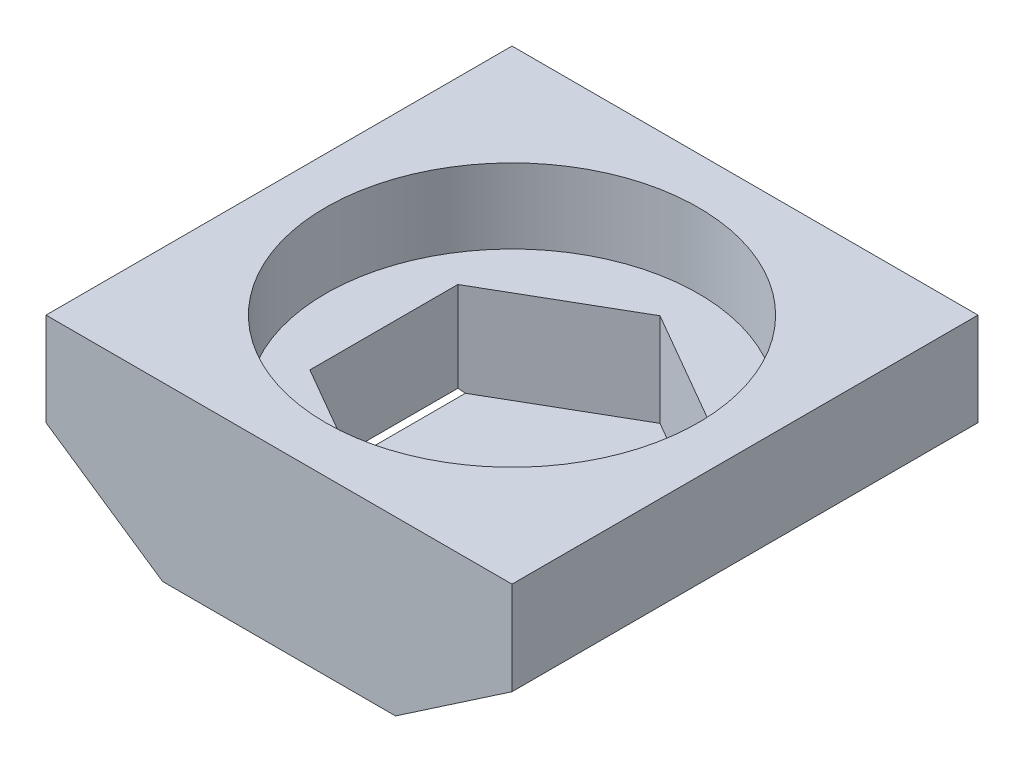
ISO-10303-21;
HEADER;
FILE_DESCRIPTION(('STEP AP214'),'2;1');
FILE_NAME('part.step','',(''),(''),'','','');
FILE_SCHEMA(('AUTOMOTIVE_DESIGN { 1 0 10303 214 1 1 1 1 }'));
ENDSEC;
DATA;
#1=APPLICATION_CONTEXT('core data for automotive mechanical design processes');
#2=APPLICATION_PROTOCOL_DEFINITION('international standard','automotive_design',2000,#1);
#3=PRODUCT_CONTEXT('',#1,'mechanical');
#4=PRODUCT('Part','Part','',(#3));
#5=PRODUCT_RELATED_PRODUCT_CATEGORY('part','',(#4));
#6=PRODUCT_DEFINITION_FORMATION('','',#4);
#7=PRODUCT_DEFINITION_CONTEXT('part definition',#1,'design');
#8=PRODUCT_DEFINITION('design','',#6,#7);
#9=PRODUCT_DEFINITION_SHAPE('','',#8);
#10=(LENGTH_UNIT() NAMED_UNIT(*) SI_UNIT(.MILLI.,.METRE.));
#11=(NAMED_UNIT(*) PLANE_ANGLE_UNIT() SI_UNIT($,.RADIAN.));
#12=(NAMED_UNIT(*) SI_UNIT($,.STERADIAN.) SOLID_ANGLE_UNIT());
#13=UNCERTAINTY_MEASURE_WITH_UNIT(LENGTH_MEASURE(1.E-05),#10,'distance_accuracy_value','');
#14=(GEOMETRIC_REPRESENTATION_CONTEXT(3) GLOBAL_UNCERTAINTY_ASSIGNED_CONTEXT((#13)) GLOBAL_UNIT_ASSIGNED_CONTEXT((#10,
#11,#12)) REPRESENTATION_CONTEXT('',''));
#15=CARTESIAN_POINT('',(0.,0.,0.));
#16=DIRECTION('',(0.,0.,1.));
#17=DIRECTION('',(1.,0.,0.));
#18=AXIS2_PLACEMENT_3D('',#15,#16,#17);
#19=CARTESIAN_POINT('',(0.,0.0999999999999994,8.17542648054294));
#20=DIRECTION('',(0.5,0.,0.866025403784438));
#21=DIRECTION('',(0.866025403784439,0.,-0.5));
#22=AXIS2_PLACEMENT_3D('',#19,#20,#21);
#23=PLANE('',#22);
#24=DIRECTION('',(-0.866025403784439,0.,0.5));
#25=VECTOR('',#24,1.);
#26=CARTESIAN_POINT('',(0.,2.1,8.17542648054294));
#27=LINE('',#26,#25);
#28=CARTESIAN_POINT('',(2.75,2.1,6.58771324027147));
#29=VERTEX_POINT('',#28);
#30=CARTESIAN_POINT('',(0.,2.1,8.17542648054294));
#31=VERTEX_POINT('',#30);
#32=EDGE_CURVE('E151',#29,#31,#27,.T.);
#33=ORIENTED_EDGE('',*,*,#32,.F.);
#34=DIRECTION('',(0.,1.,0.));
#35=VECTOR('',#34,1.);
#36=CARTESIAN_POINT('',(2.75,0.0999999999999994,6.58771324027147));
#37=LINE('',#36,#35);
#38=CARTESIAN_POINT('',(2.75,0.169999999999999,6.58771324027147));
#39=VERTEX_POINT('',#38);
#40=EDGE_CURVE('E161',#39,#29,#37,.T.);
#41=ORIENTED_EDGE('',*,*,#40,.F.);
#42=DIRECTION('',(0.746240950950534,0.507443846646363,-0.430842413911613));
#43=VECTOR('',#42,1.);
#44=CARTESIAN_POINT('',(1.44931429353943,-0.71446628039319,7.33866448302758));
#45=LINE('',#44,#43);
#46=CARTESIAN_POINT('',(2.64705882352941,0.0999999999999994,6.64714635621746));
#47=VERTEX_POINT('',#46);
#48=EDGE_CURVE('E177',#47,#39,#45,.T.);
#49=ORIENTED_EDGE('',*,*,#48,.F.);
#50=DIRECTION('',(0.866025403784439,0.,-0.5));
#51=VECTOR('',#50,1.);
#52=CARTESIAN_POINT('',(0.,0.0999999999999994,8.17542648054294));
#53=LINE('',#52,#51);
#54=CARTESIAN_POINT('',(0.,0.0999999999999994,8.17542648054294));
#55=VERTEX_POINT('',#54);
#56=EDGE_CURVE('E59',#55,#47,#53,.T.);
#57=ORIENTED_EDGE('',*,*,#56,.F.);
#58=DIRECTION('',(0.,1.,0.));
#59=VECTOR('',#58,1.);
#60=CARTESIAN_POINT('',(0.,0.0999999999999994,8.17542648054294));
#61=LINE('',#60,#59);
#62=EDGE_CURVE('E171',#55,#31,#61,.T.);
#63=ORIENTED_EDGE('',*,*,#62,.T.);
#64=EDGE_LOOP('',(#33,#41,#49,#57,#63));
#65=FACE_BOUND('',#64,.T.);
#66=ADVANCED_FACE('F37',(#65),#23,.F.);
#67=CARTESIAN_POINT('',(2.75,0.0999999999999994,3.41228675972852));
#68=DIRECTION('',(0.5,0.,-0.866025403784439));
#69=DIRECTION('',(-0.866025403784439,0.,-0.5));
#70=AXIS2_PLACEMENT_3D('',#67,#68,#69);
#71=PLANE('',#70);
#72=DIRECTION('',(0.866025403784439,0.,0.5));
#73=VECTOR('',#72,1.);
#74=CARTESIAN_POINT('',(2.75,2.1,3.41228675972852));
#75=LINE('',#74,#73);
#76=CARTESIAN_POINT('',(0.,2.1,1.82457351945705));
#77=VERTEX_POINT('',#76);
#78=CARTESIAN_POINT('',(2.75,2.1,3.41228675972852));
#79=VERTEX_POINT('',#78);
#80=EDGE_CURVE('E136',#77,#79,#75,.T.);
#81=ORIENTED_EDGE('',*,*,#80,.F.);
#82=DIRECTION('',(0.,1.,0.));
#83=VECTOR('',#82,1.);
#84=CARTESIAN_POINT('',(0.,0.0999999999999994,1.82457351945705));
#85=LINE('',#84,#83);
#86=CARTESIAN_POINT('',(0.,0.0999999999999994,1.82457351945705));
#87=VERTEX_POINT('',#86);
#88=EDGE_CURVE('E147',#87,#77,#85,.T.);
#89=ORIENTED_EDGE('',*,*,#88,.F.);
#90=DIRECTION('',(-0.866025403784439,0.,-0.5));
#91=VECTOR('',#90,1.);
#92=CARTESIAN_POINT('',(2.75,0.0999999999999994,3.41228675972852));
#93=LINE('',#92,#91);
#94=CARTESIAN_POINT('',(2.64705882352941,0.0999999999999994,3.35285364378253));
#95=VERTEX_POINT('',#94);
#96=EDGE_CURVE('E250',#95,#87,#93,.T.);
#97=ORIENTED_EDGE('',*,*,#96,.F.);
#98=DIRECTION('',(-0.746240950950534,-0.507443846646363,-0.430842413911613));
#99=VECTOR('',#98,1.);
#100=CARTESIAN_POINT('',(4.66443682021169,1.47181703774395,4.51758737322427));
#101=LINE('',#100,#99);
#102=CARTESIAN_POINT('',(2.75,0.169999999999999,3.41228675972852));
#103=VERTEX_POINT('',#102);
#104=EDGE_CURVE('E174',#103,#95,#101,.T.);
#105=ORIENTED_EDGE('',*,*,#104,.F.);
#106=DIRECTION('',(0.,1.,0.));
#107=VECTOR('',#106,1.);
#108=CARTESIAN_POINT('',(2.75,0.0999999999999994,3.41228675972852));
#109=LINE('',#108,#107);
#110=EDGE_CURVE('E150',#103,#79,#109,.T.);
#111=ORIENTED_EDGE('',*,*,#110,.T.);
#112=EDGE_LOOP('',(#81,#89,#97,#105,#111));
#113=FACE_BOUND('',#112,.T.);
#114=ADVANCED_FACE('F145',(#113),#71,.F.);
#115=CARTESIAN_POINT('',(2.75,0.0999999999999994,6.58771324027147));
#116=DIRECTION('',(1.,0.,0.));
#117=DIRECTION('',(0.,0.,-1.));
#118=AXIS2_PLACEMENT_3D('',#115,#116,#117);
#119=PLANE('',#118);
#120=DIRECTION('',(0.,0.,1.));
#121=VECTOR('',#120,1.);
#122=CARTESIAN_POINT('',(2.75,2.1,6.58771324027147));
#123=LINE('',#122,#121);
#124=EDGE_CURVE('E253',#79,#29,#123,.T.);
#125=ORIENTED_EDGE('',*,*,#124,.F.);
#126=ORIENTED_EDGE('',*,*,#110,.F.);
#127=DIRECTION('',(0.,0.,-1.));
#128=VECTOR('',#127,1.);
#129=CARTESIAN_POINT('',(2.75,0.17,10.));
#130=LINE('',#129,#128);
#131=EDGE_CURVE('E170',#39,#103,#130,.T.);
#132=ORIENTED_EDGE('',*,*,#131,.F.);
#133=ORIENTED_EDGE('',*,*,#40,.T.);
#134=EDGE_LOOP('',(#125,#126,#132,#133));
#135=FACE_BOUND('',#134,.T.);
#136=ADVANCED_FACE('F316',(#135),#119,.F.);
#137=CARTESIAN_POINT('',(-2.75,0.0999999999999994,6.58771324027147));
#138=DIRECTION('',(-0.5,0.,0.866025403784438));
#139=DIRECTION('',(0.866025403784439,0.,0.5));
#140=AXIS2_PLACEMENT_3D('',#137,#138,#139);
#141=PLANE('',#140);
#142=DIRECTION('',(-0.866025403784439,0.,-0.5));
#143=VECTOR('',#142,1.);
#144=CARTESIAN_POINT('',(-2.75,2.1,6.58771324027147));
#145=LINE('',#144,#143);
#146=CARTESIAN_POINT('',(-2.75,2.1,6.58771324027147));
#147=VERTEX_POINT('',#146);
#148=EDGE_CURVE('E152',#31,#147,#145,.T.);
#149=ORIENTED_EDGE('',*,*,#148,.F.);
#150=ORIENTED_EDGE('',*,*,#62,.F.);
#151=DIRECTION('',(0.866025403784438,0.,0.5));
#152=VECTOR('',#151,1.);
#153=CARTESIAN_POINT('',(-2.75,0.0999999999999994,6.58771324027147));
#154=LINE('',#153,#152);
#155=CARTESIAN_POINT('',(-2.64705882352941,0.0999999999999994,6.64714635621746));
#156=VERTEX_POINT('',#155);
#157=EDGE_CURVE('E167',#156,#55,#154,.T.);
#158=ORIENTED_EDGE('',*,*,#157,.F.);
#159=DIRECTION('',(0.746240950950534,-0.507443846646363,0.430842413911613));
#160=VECTOR('',#159,1.);
#161=CARTESIAN_POINT('',(-1.44931429353943,-0.714466280393189,7.33866448302758));
#162=LINE('',#161,#160);
#163=CARTESIAN_POINT('',(-2.75,0.169999999999999,6.58771324027147));
#164=VERTEX_POINT('',#163);
#165=EDGE_CURVE('E45',#164,#156,#162,.T.);
#166=ORIENTED_EDGE('',*,*,#165,.F.);
#167=DIRECTION('',(0.,1.,0.));
#168=VECTOR('',#167,1.);
#169=CARTESIAN_POINT('',(-2.75,0.0999999999999994,6.58771324027147));
#170=LINE('',#169,#168);
#171=EDGE_CURVE('E159',#164,#147,#170,.T.);
#172=ORIENTED_EDGE('',*,*,#171,.T.);
#173=EDGE_LOOP('',(#149,#150,#158,#166,#172));
#174=FACE_BOUND('',#173,.T.);
#175=ADVANCED_FACE('F241',(#174),#141,.F.);
#176=CARTESIAN_POINT('',(-2.75,0.0999999999999994,3.41228675972853));
#177=DIRECTION('',(-1.,0.,0.));
#178=DIRECTION('',(0.,0.,1.));
#179=AXIS2_PLACEMENT_3D('',#176,#177,#178);
#180=PLANE('',#179);
#181=DIRECTION('',(0.,0.,-1.));
#182=VECTOR('',#181,1.);
#183=CARTESIAN_POINT('',(-2.75,2.1,3.41228675972853));
#184=LINE('',#183,#182);
#185=CARTESIAN_POINT('',(-2.75,2.1,3.41228675972853));
#186=VERTEX_POINT('',#185);
#187=EDGE_CURVE('E51',#147,#186,#184,.T.);
#188=ORIENTED_EDGE('',*,*,#187,.F.);
#189=ORIENTED_EDGE('',*,*,#171,.F.);
#190=DIRECTION('',(0.,0.,1.));
#191=VECTOR('',#190,1.);
#192=CARTESIAN_POINT('',(-2.75,0.17,10.));
#193=LINE('',#192,#191);
#194=CARTESIAN_POINT('',(-2.75,0.169999999999998,3.41228675972853));
#195=VERTEX_POINT('',#194);
#196=EDGE_CURVE('E229',#195,#164,#193,.T.);
#197=ORIENTED_EDGE('',*,*,#196,.F.);
#198=DIRECTION('',(0.,1.,0.));
#199=VECTOR('',#198,1.);
#200=CARTESIAN_POINT('',(-2.75,0.0999999999999994,3.41228675972853));
#201=LINE('',#200,#199);
#202=EDGE_CURVE('E157',#195,#186,#201,.T.);
#203=ORIENTED_EDGE('',*,*,#202,.T.);
#204=EDGE_LOOP('',(#188,#189,#197,#203));
#205=FACE_BOUND('',#204,.T.);
#206=ADVANCED_FACE('F244',(#205),#180,.F.);
#207=CARTESIAN_POINT('',(0.,0.0999999999999994,1.82457351945705));
#208=DIRECTION('',(-0.5,0.,-0.866025403784439));
#209=DIRECTION('',(-0.866025403784439,0.,0.5));
#210=AXIS2_PLACEMENT_3D('',#207,#208,#209);
#211=PLANE('',#210);
#212=DIRECTION('',(0.866025403784439,0.,-0.5));
#213=VECTOR('',#212,1.);
#214=CARTESIAN_POINT('',(0.,2.1,1.82457351945705));
#215=LINE('',#214,#213);
#216=EDGE_CURVE('E12',#186,#77,#215,.T.);
#217=ORIENTED_EDGE('',*,*,#216,.F.);
#218=ORIENTED_EDGE('',*,*,#202,.F.);
#219=DIRECTION('',(-0.746240950950534,0.507443846646363,0.430842413911613));
#220=VECTOR('',#219,1.);
#221=CARTESIAN_POINT('',(-4.66443682021169,1.47181703774394,4.51758737322428));
#222=LINE('',#221,#220);
#223=CARTESIAN_POINT('',(-2.64705882352941,0.0999999999999994,3.35285364378254));
#224=VERTEX_POINT('',#223);
#225=EDGE_CURVE('E226',#224,#195,#222,.T.);
#226=ORIENTED_EDGE('',*,*,#225,.F.);
#227=DIRECTION('',(-0.866025403784439,0.,0.5));
#228=VECTOR('',#227,1.);
#229=CARTESIAN_POINT('',(0.,0.0999999999999994,1.82457351945705));
#230=LINE('',#229,#228);
#231=EDGE_CURVE('E156',#87,#224,#230,.T.);
#232=ORIENTED_EDGE('',*,*,#231,.F.);
#233=ORIENTED_EDGE('',*,*,#88,.T.);
#234=EDGE_LOOP('',(#217,#218,#226,#232,#233));
#235=FACE_BOUND('',#234,.T.);
#236=ADVANCED_FACE('F154',(#235),#211,.F.);
#237=CARTESIAN_POINT('',(2.5,0.,10.));
#238=DIRECTION('',(-0.562310021407279,0.826926502069528,0.));
#239=DIRECTION('',(-0.826926502069528,-0.562310021407279,0.));
#240=AXIS2_PLACEMENT_3D('',#237,#238,#239);
#241=PLANE('',#240);
#242=ORIENTED_EDGE('',*,*,#48,.T.);
#243=ORIENTED_EDGE('',*,*,#131,.T.);
#244=ORIENTED_EDGE('',*,*,#104,.T.);
#245=DIRECTION('',(0.,0.,-1.));
#246=VECTOR('',#245,1.);
#247=CARTESIAN_POINT('',(2.64705882352941,0.0999999999999994,10.));
#248=LINE('',#247,#246);
#249=EDGE_CURVE('E168',#47,#95,#248,.T.);
#250=ORIENTED_EDGE('',*,*,#249,.F.);
#251=EDGE_LOOP('',(#242,#243,#244,#250));
#252=FACE_BOUND('',#251,.T.);
#253=DIRECTION('',(0.826926502069528,0.562310021407279,0.));
#254=VECTOR('',#253,1.);
#255=CARTESIAN_POINT('',(2.5,0.,0.));
#256=LINE('',#255,#254);
#257=CARTESIAN_POINT('',(2.5,0.,0.));
#258=VERTEX_POINT('',#257);
#259=CARTESIAN_POINT('',(5.,1.7,0.));
#260=VERTEX_POINT('',#259);
#261=EDGE_CURVE('E180',#258,#260,#256,.T.);
#262=ORIENTED_EDGE('',*,*,#261,.T.);
#263=DIRECTION('',(0.,0.,-1.));
#264=VECTOR('',#263,1.);
#265=CARTESIAN_POINT('',(5.,1.7,10.));
#266=LINE('',#265,#264);
#267=CARTESIAN_POINT('',(5.,1.7,10.));
#268=VERTEX_POINT('',#267);
#269=EDGE_CURVE('E221',#268,#260,#266,.T.);
#270=ORIENTED_EDGE('',*,*,#269,.F.);
#271=DIRECTION('',(0.826926502069528,0.562310021407279,0.));
#272=VECTOR('',#271,1.);
#273=CARTESIAN_POINT('',(2.5,0.,10.));
#274=LINE('',#273,#272);
#275=CARTESIAN_POINT('',(2.5,0.,10.));
#276=VERTEX_POINT('',#275);
#277=EDGE_CURVE('E181',#276,#268,#274,.T.);
#278=ORIENTED_EDGE('',*,*,#277,.F.);
#279=DIRECTION('',(0.,0.,-1.));
#280=VECTOR('',#279,1.);
#281=CARTESIAN_POINT('',(2.5,0.,10.));
#282=LINE('',#281,#280);
#283=EDGE_CURVE('E195',#276,#258,#282,.T.);
#284=ORIENTED_EDGE('',*,*,#283,.T.);
#285=EDGE_LOOP('',(#262,#270,#278,#284));
#286=FACE_BOUND('',#285,.T.);
#287=ADVANCED_FACE('F39',(#252,#286),#241,.F.);
#288=CARTESIAN_POINT('',(5.,1.7,10.));
#289=DIRECTION('',(-1.,0.,0.));
#290=DIRECTION('',(0.,0.,1.));
#291=AXIS2_PLACEMENT_3D('',#288,#289,#290);
#292=PLANE('',#291);
#293=DIRECTION('',(0.,1.,0.));
#294=VECTOR('',#293,1.);
#295=CARTESIAN_POINT('',(5.,1.7,0.));
#296=LINE('',#295,#294);
#297=CARTESIAN_POINT('',(5.,3.7,0.));
#298=VERTEX_POINT('',#297);
#299=EDGE_CURVE('E198',#260,#298,#296,.T.);
#300=ORIENTED_EDGE('',*,*,#299,.T.);
#301=DIRECTION('',(0.,0.,-1.));
#302=VECTOR('',#301,1.);
#303=CARTESIAN_POINT('',(5.,3.7,10.));
#304=LINE('',#303,#302);
#305=CARTESIAN_POINT('',(5.,3.7,10.));
#306=VERTEX_POINT('',#305);
#307=EDGE_CURVE('E218',#306,#298,#304,.T.);
#308=ORIENTED_EDGE('',*,*,#307,.F.);
#309=DIRECTION('',(0.,1.,0.));
#310=VECTOR('',#309,1.);
#311=CARTESIAN_POINT('',(5.,1.7,10.));
#312=LINE('',#311,#310);
#313=EDGE_CURVE('E184',#268,#306,#312,.T.);
#314=ORIENTED_EDGE('',*,*,#313,.F.);
#315=ORIENTED_EDGE('',*,*,#269,.T.);
#316=EDGE_LOOP('',(#300,#308,#314,#315));
#317=FACE_BOUND('',#316,.T.);
#318=ADVANCED_FACE('F276',(#317),#292,.F.);
#319=CARTESIAN_POINT('',(-5.,3.7,10.));
#320=DIRECTION('',(0.,-1.,0.));
#321=DIRECTION('',(0.,0.,-1.));
#322=AXIS2_PLACEMENT_3D('',#319,#320,#321);
#323=PLANE('',#322);
#324=CARTESIAN_POINT('',(0.,3.7,5.));
#325=DIRECTION('',(0.,1.,0.));
#326=DIRECTION('',(0.,0.,1.));
#327=AXIS2_PLACEMENT_3D('',#324,#325,#326);
#328=CIRCLE('',#327,4.);
#329=CARTESIAN_POINT('',(0.,3.7,9.));
#330=VERTEX_POINT('',#329);
#331=EDGE_CURVE('E259',#330,#330,#328,.T.);
#332=ORIENTED_EDGE('',*,*,#331,.F.);
#333=EDGE_LOOP('',(#332));
#334=FACE_BOUND('',#333,.T.);
#335=DIRECTION('',(-1.,0.,0.));
#336=VECTOR('',#335,1.);
#337=CARTESIAN_POINT('',(-5.,3.7,0.));
#338=LINE('',#337,#336);
#339=CARTESIAN_POINT('',(-5.,3.7,0.));
#340=VERTEX_POINT('',#339);
#341=EDGE_CURVE('E200',#298,#340,#338,.T.);
#342=ORIENTED_EDGE('',*,*,#341,.T.);
#343=DIRECTION('',(0.,0.,-1.));
#344=VECTOR('',#343,1.);
#345=CARTESIAN_POINT('',(-5.,3.7,10.));
#346=LINE('',#345,#344);
#347=CARTESIAN_POINT('',(-5.,3.7,10.));
#348=VERTEX_POINT('',#347);
#349=EDGE_CURVE('E215',#348,#340,#346,.T.);
#350=ORIENTED_EDGE('',*,*,#349,.F.);
#351=DIRECTION('',(-1.,0.,0.));
#352=VECTOR('',#351,1.);
#353=CARTESIAN_POINT('',(-5.,3.7,10.));
#354=LINE('',#353,#352);
#355=EDGE_CURVE('E187',#306,#348,#354,.T.);
#356=ORIENTED_EDGE('',*,*,#355,.F.);
#357=ORIENTED_EDGE('',*,*,#307,.T.);
#358=EDGE_LOOP('',(#342,#350,#356,#357));
#359=FACE_BOUND('',#358,.T.);
#360=ADVANCED_FACE('F272',(#334,#359),#323,.F.);
#361=CARTESIAN_POINT('',(-5.,1.7,10.));
#362=DIRECTION('',(1.,0.,0.));
#363=DIRECTION('',(0.,0.,-1.));
#364=AXIS2_PLACEMENT_3D('',#361,#362,#363);
#365=PLANE('',#364);
#366=DIRECTION('',(0.,-1.,0.));
#367=VECTOR('',#366,1.);
#368=CARTESIAN_POINT('',(-5.,1.7,0.));
#369=LINE('',#368,#367);
#370=CARTESIAN_POINT('',(-5.,1.7,0.));
#371=VERTEX_POINT('',#370);
#372=EDGE_CURVE('E202',#340,#371,#369,.T.);
#373=ORIENTED_EDGE('',*,*,#372,.T.);
#374=DIRECTION('',(0.,0.,-1.));
#375=VECTOR('',#374,1.);
#376=CARTESIAN_POINT('',(-5.,1.7,10.));
#377=LINE('',#376,#375);
#378=CARTESIAN_POINT('',(-5.,1.7,10.));
#379=VERTEX_POINT('',#378);
#380=EDGE_CURVE('E212',#379,#371,#377,.T.);
#381=ORIENTED_EDGE('',*,*,#380,.F.);
#382=DIRECTION('',(0.,-1.,0.));
#383=VECTOR('',#382,1.);
#384=CARTESIAN_POINT('',(-5.,1.7,10.));
#385=LINE('',#384,#383);
#386=EDGE_CURVE('E189',#348,#379,#385,.T.);
#387=ORIENTED_EDGE('',*,*,#386,.F.);
#388=ORIENTED_EDGE('',*,*,#349,.T.);
#389=EDGE_LOOP('',(#373,#381,#387,#388));
#390=FACE_BOUND('',#389,.T.);
#391=ADVANCED_FACE('F275',(#390),#365,.F.);
#392=CARTESIAN_POINT('',(-2.5,0.,10.));
#393=DIRECTION('',(0.562310021407279,0.826926502069528,0.));
#394=DIRECTION('',(-0.826926502069528,0.562310021407279,0.));
#395=AXIS2_PLACEMENT_3D('',#392,#393,#394);
#396=PLANE('',#395);
#397=ORIENTED_EDGE('',*,*,#196,.T.);
#398=ORIENTED_EDGE('',*,*,#165,.T.);
#399=DIRECTION('',(0.,0.,1.));
#400=VECTOR('',#399,1.);
#401=CARTESIAN_POINT('',(-2.64705882352941,0.0999999999999994,10.));
#402=LINE('',#401,#400);
#403=EDGE_CURVE('E224',#224,#156,#402,.T.);
#404=ORIENTED_EDGE('',*,*,#403,.F.);
#405=ORIENTED_EDGE('',*,*,#225,.T.);
#406=EDGE_LOOP('',(#397,#398,#404,#405));
#407=FACE_BOUND('',#406,.T.);
#408=DIRECTION('',(0.826926502069528,-0.562310021407279,0.));
#409=VECTOR('',#408,1.);
#410=CARTESIAN_POINT('',(-2.5,0.,0.));
#411=LINE('',#410,#409);
#412=CARTESIAN_POINT('',(-2.5,0.,0.));
#413=VERTEX_POINT('',#412);
#414=EDGE_CURVE('E204',#371,#413,#411,.T.);
#415=ORIENTED_EDGE('',*,*,#414,.T.);
#416=DIRECTION('',(0.,0.,-1.));
#417=VECTOR('',#416,1.);
#418=CARTESIAN_POINT('',(-2.5,0.,10.));
#419=LINE('',#418,#417);
#420=CARTESIAN_POINT('',(-2.5,0.,10.));
#421=VERTEX_POINT('',#420);
#422=EDGE_CURVE('E209',#421,#413,#419,.T.);
#423=ORIENTED_EDGE('',*,*,#422,.F.);
#424=DIRECTION('',(0.826926502069528,-0.562310021407279,0.));
#425=VECTOR('',#424,1.);
#426=CARTESIAN_POINT('',(-2.5,0.,10.));
#427=LINE('',#426,#425);
#428=EDGE_CURVE('E191',#379,#421,#427,.T.);
#429=ORIENTED_EDGE('',*,*,#428,.F.);
#430=ORIENTED_EDGE('',*,*,#380,.T.);
#431=EDGE_LOOP('',(#415,#423,#429,#430));
#432=FACE_BOUND('',#431,.T.);
#433=ADVANCED_FACE('F234',(#407,#432),#396,.F.);
#434=CARTESIAN_POINT('',(2.5,0.,10.));
#435=DIRECTION('',(0.,1.,0.));
#436=DIRECTION('',(0.,0.,1.));
#437=AXIS2_PLACEMENT_3D('',#434,#435,#436);
#438=PLANE('',#437);
#439=DIRECTION('',(1.,0.,0.));
#440=VECTOR('',#439,1.);
#441=CARTESIAN_POINT('',(2.5,0.,0.));
#442=LINE('',#441,#440);
#443=EDGE_CURVE('E185',#413,#258,#442,.T.);
#444=ORIENTED_EDGE('',*,*,#443,.T.);
#445=ORIENTED_EDGE('',*,*,#283,.F.);
#446=DIRECTION('',(1.,0.,0.));
#447=VECTOR('',#446,1.);
#448=CARTESIAN_POINT('',(2.5,0.,10.));
#449=LINE('',#448,#447);
#450=EDGE_CURVE('E193',#421,#276,#449,.T.);
#451=ORIENTED_EDGE('',*,*,#450,.F.);
#452=ORIENTED_EDGE('',*,*,#422,.T.);
#453=EDGE_LOOP('',(#444,#445,#451,#452));
#454=FACE_BOUND('',#453,.T.);
#455=ADVANCED_FACE('F295',(#454),#438,.F.);
#456=CARTESIAN_POINT('',(0.,0.,10.));
#457=DIRECTION('',(0.,0.,1.));
#458=DIRECTION('',(1.,0.,0.));
#459=AXIS2_PLACEMENT_3D('',#456,#457,#458);
#460=PLANE('',#459);
#461=ORIENTED_EDGE('',*,*,#277,.T.);
#462=ORIENTED_EDGE('',*,*,#313,.T.);
#463=ORIENTED_EDGE('',*,*,#355,.T.);
#464=ORIENTED_EDGE('',*,*,#386,.T.);
#465=ORIENTED_EDGE('',*,*,#428,.T.);
#466=ORIENTED_EDGE('',*,*,#450,.T.);
#467=EDGE_LOOP('',(#461,#462,#463,#464,#465,#466));
#468=FACE_BOUND('',#467,.T.);
#469=ADVANCED_FACE('F299',(#468),#460,.T.);
#470=CARTESIAN_POINT('',(0.,0.,0.));
#471=DIRECTION('',(0.,0.,1.));
#472=DIRECTION('',(1.,0.,0.));
#473=AXIS2_PLACEMENT_3D('',#470,#471,#472);
#474=PLANE('',#473);
#475=ORIENTED_EDGE('',*,*,#261,.F.);
#476=ORIENTED_EDGE('',*,*,#443,.F.);
#477=ORIENTED_EDGE('',*,*,#414,.F.);
#478=ORIENTED_EDGE('',*,*,#372,.F.);
#479=ORIENTED_EDGE('',*,*,#341,.F.);
#480=ORIENTED_EDGE('',*,*,#299,.F.);
#481=EDGE_LOOP('',(#475,#476,#477,#478,#479,#480));
#482=FACE_BOUND('',#481,.T.);
#483=ADVANCED_FACE('F289',(#482),#474,.F.);
#484=CARTESIAN_POINT('',(0.,0.0999999999999994,0.));
#485=DIRECTION('',(0.,1.,0.));
#486=DIRECTION('',(0.,0.,1.));
#487=AXIS2_PLACEMENT_3D('',#484,#485,#486);
#488=PLANE('',#487);
#489=ORIENTED_EDGE('',*,*,#249,.T.);
#490=ORIENTED_EDGE('',*,*,#96,.T.);
#491=ORIENTED_EDGE('',*,*,#231,.T.);
#492=ORIENTED_EDGE('',*,*,#403,.T.);
#493=ORIENTED_EDGE('',*,*,#157,.T.);
#494=ORIENTED_EDGE('',*,*,#56,.T.);
#495=EDGE_LOOP('',(#489,#490,#491,#492,#493,#494));
#496=FACE_BOUND('',#495,.T.);
#497=ADVANCED_FACE('F325',(#496),#488,.T.);
#498=CARTESIAN_POINT('',(0.,2.1,5.));
#499=DIRECTION('',(0.,1.,0.));
#500=DIRECTION('',(0.,0.,1.));
#501=AXIS2_PLACEMENT_3D('',#498,#499,#500);
#502=PLANE('',#501);
#503=CARTESIAN_POINT('',(0.,2.1,5.));
#504=DIRECTION('',(0.,1.,0.));
#505=DIRECTION('',(0.,0.,1.));
#506=AXIS2_PLACEMENT_3D('',#503,#504,#505);
#507=CIRCLE('',#506,4.);
#508=CARTESIAN_POINT('',(0.,2.1,9.));
#509=VERTEX_POINT('',#508);
#510=EDGE_CURVE('E258',#509,#509,#507,.T.);
#511=ORIENTED_EDGE('',*,*,#510,.T.);
#512=EDGE_LOOP('',(#511));
#513=FACE_BOUND('',#512,.T.);
#514=ORIENTED_EDGE('',*,*,#124,.T.);
#515=ORIENTED_EDGE('',*,*,#32,.T.);
#516=ORIENTED_EDGE('',*,*,#148,.T.);
#517=ORIENTED_EDGE('',*,*,#187,.T.);
#518=ORIENTED_EDGE('',*,*,#216,.T.);
#519=ORIENTED_EDGE('',*,*,#80,.T.);
#520=EDGE_LOOP('',(#514,#515,#516,#517,#518,#519));
#521=FACE_BOUND('',#520,.T.);
#522=ADVANCED_FACE('F135',(#513,#521),#502,.T.);
#523=CARTESIAN_POINT('',(0.,2.1,5.));
#524=DIRECTION('',(0.,1.,0.));
#525=DIRECTION('',(0.,0.,1.));
#526=AXIS2_PLACEMENT_3D('',#523,#524,#525);
#527=CYLINDRICAL_SURFACE('',#526,4.);
#528=ORIENTED_EDGE('',*,*,#510,.F.);
#529=EDGE_LOOP('',(#528));
#530=FACE_BOUND('',#529,.T.);
#531=ORIENTED_EDGE('',*,*,#331,.T.);
#532=EDGE_LOOP('',(#531));
#533=FACE_BOUND('',#532,.T.);
#534=ADVANCED_FACE('F266',(#530,#533),#527,.F.);
#535=CLOSED_SHELL('',(#66,#114,#136,#175,#206,#236,#287,#318,#360,#391,#433,#455,#469,#483,#497,
#522,#534));
#536=MANIFOLD_SOLID_BREP('B2',#535);
#537=ADVANCED_BREP_SHAPE_REPRESENTATION('',(#18,#536),#14);
#538=SHAPE_DEFINITION_REPRESENTATION(#9,#537);
ENDSEC;
END-ISO-10303-21;
